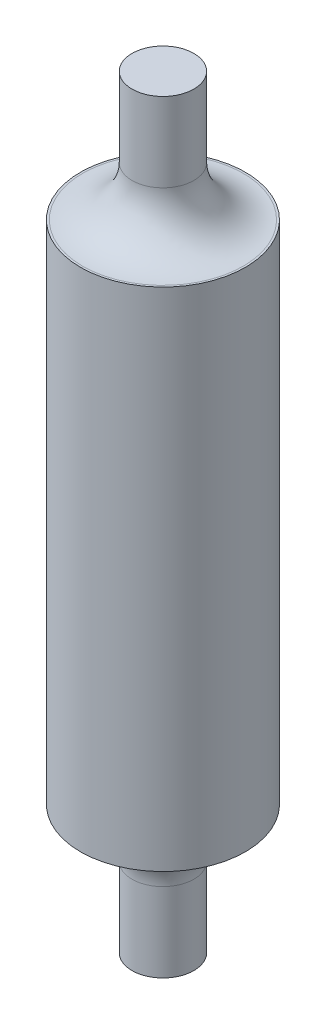
ISO-10303-21;
HEADER;
FILE_DESCRIPTION(('STEP AP214'),'2;1');
FILE_NAME('part.step','',(''),(''),'','','');
FILE_SCHEMA(('AUTOMOTIVE_DESIGN { 1 0 10303 214 1 1 1 1 }'));
ENDSEC;
DATA;
#1=APPLICATION_CONTEXT('core data for automotive mechanical design processes');
#2=APPLICATION_PROTOCOL_DEFINITION('international standard','automotive_design',2000,#1);
#3=PRODUCT_CONTEXT('',#1,'mechanical');
#4=PRODUCT('Part','Part','',(#3));
#5=PRODUCT_RELATED_PRODUCT_CATEGORY('part','',(#4));
#6=PRODUCT_DEFINITION_FORMATION('','',#4);
#7=PRODUCT_DEFINITION_CONTEXT('part definition',#1,'design');
#8=PRODUCT_DEFINITION('design','',#6,#7);
#9=PRODUCT_DEFINITION_SHAPE('','',#8);
#10=(LENGTH_UNIT() NAMED_UNIT(*) SI_UNIT(.MILLI.,.METRE.));
#11=(NAMED_UNIT(*) PLANE_ANGLE_UNIT() SI_UNIT($,.RADIAN.));
#12=(NAMED_UNIT(*) SI_UNIT($,.STERADIAN.) SOLID_ANGLE_UNIT());
#13=UNCERTAINTY_MEASURE_WITH_UNIT(LENGTH_MEASURE(1.E-05),#10,'distance_accuracy_value','');
#14=(GEOMETRIC_REPRESENTATION_CONTEXT(3) GLOBAL_UNCERTAINTY_ASSIGNED_CONTEXT((#13)) GLOBAL_UNIT_ASSIGNED_CONTEXT((#10,
#11,#12)) REPRESENTATION_CONTEXT('',''));
#15=CARTESIAN_POINT('',(0.,0.,0.));
#16=DIRECTION('',(0.,0.,1.));
#17=DIRECTION('',(1.,0.,0.));
#18=AXIS2_PLACEMENT_3D('',#15,#16,#17);
#19=CARTESIAN_POINT('',(0.,77.978,0.));
#20=DIRECTION('',(0.,-1.,0.));
#21=DIRECTION('',(0.,0.,-1.));
#22=AXIS2_PLACEMENT_3D('',#19,#20,#21);
#23=CYLINDRICAL_SURFACE('',#22,12.7);
#24=CARTESIAN_POINT('',(0.,77.978,0.));
#25=DIRECTION('',(0.,1.,0.));
#26=DIRECTION('',(0.,0.,1.));
#27=AXIS2_PLACEMENT_3D('',#24,#25,#26);
#28=CIRCLE('',#27,12.7);
#29=CARTESIAN_POINT('',(0.,77.978,12.7));
#30=VERTEX_POINT('',#29);
#31=EDGE_CURVE('E60',#30,#30,#28,.T.);
#32=ORIENTED_EDGE('',*,*,#31,.F.);
#33=EDGE_LOOP('',(#32));
#34=FACE_BOUND('',#33,.T.);
#35=CARTESIAN_POINT('',(0.,0.,0.));
#36=DIRECTION('',(0.,1.,0.));
#37=DIRECTION('',(0.,0.,1.));
#38=AXIS2_PLACEMENT_3D('',#35,#36,#37);
#39=CIRCLE('',#38,12.7);
#40=CARTESIAN_POINT('',(0.,0.,12.7));
#41=VERTEX_POINT('',#40);
#42=EDGE_CURVE('E61',#41,#41,#39,.T.);
#43=ORIENTED_EDGE('',*,*,#42,.T.);
#44=EDGE_LOOP('',(#43));
#45=FACE_BOUND('',#44,.T.);
#46=ADVANCED_FACE('F40',(#34,#45),#23,.T.);
#47=CARTESIAN_POINT('',(0.,77.978,0.));
#48=DIRECTION('',(0.,1.,0.));
#49=DIRECTION('',(0.,0.,1.));
#50=AXIS2_PLACEMENT_3D('',#47,#48,#49);
#51=PLANE('',#50);
#52=CARTESIAN_POINT('',(0.,77.978,0.));
#53=DIRECTION('',(0.,1.,0.));
#54=DIRECTION('',(0.,0.,1.));
#55=AXIS2_PLACEMENT_3D('',#52,#53,#54);
#56=CIRCLE('',#55,12.3825);
#57=CARTESIAN_POINT('',(0.,77.978,12.3825));
#58=VERTEX_POINT('',#57);
#59=EDGE_CURVE('E10',#58,#58,#56,.F.);
#60=ORIENTED_EDGE('',*,*,#59,.T.);
#61=EDGE_LOOP('',(#60));
#62=FACE_BOUND('',#61,.T.);
#63=ORIENTED_EDGE('',*,*,#31,.T.);
#64=EDGE_LOOP('',(#63));
#65=FACE_BOUND('',#64,.T.);
#66=ADVANCED_FACE('F90',(#62,#65),#51,.T.);
#67=CARTESIAN_POINT('',(0.,0.,0.));
#68=DIRECTION('',(0.,1.,0.));
#69=DIRECTION('',(0.,0.,1.));
#70=AXIS2_PLACEMENT_3D('',#67,#68,#69);
#71=PLANE('',#70);
#72=CARTESIAN_POINT('',(0.,0.,0.));
#73=DIRECTION('',(0.,1.,0.));
#74=DIRECTION('',(0.,0.,1.));
#75=AXIS2_PLACEMENT_3D('',#72,#73,#74);
#76=CIRCLE('',#75,12.3825);
#77=CARTESIAN_POINT('',(0.,0.,12.3825));
#78=VERTEX_POINT('',#77);
#79=EDGE_CURVE('E55',#78,#78,#76,.T.);
#80=ORIENTED_EDGE('',*,*,#79,.T.);
#81=EDGE_LOOP('',(#80));
#82=FACE_BOUND('',#81,.T.);
#83=ORIENTED_EDGE('',*,*,#42,.F.);
#84=EDGE_LOOP('',(#83));
#85=FACE_BOUND('',#84,.T.);
#86=ADVANCED_FACE('F95',(#82,#85),#71,.F.);
#87=CARTESIAN_POINT('',(0.,97.79,0.));
#88=DIRECTION('',(0.,-1.,0.));
#89=DIRECTION('',(0.,0.,-1.));
#90=AXIS2_PLACEMENT_3D('',#87,#88,#89);
#91=CYLINDRICAL_SURFACE('',#90,4.7625);
#92=CARTESIAN_POINT('',(0.,85.598,0.));
#93=DIRECTION('',(0.,1.,0.));
#94=DIRECTION('',(0.,0.,1.));
#95=AXIS2_PLACEMENT_3D('',#92,#93,#94);
#96=CIRCLE('',#95,4.7625);
#97=CARTESIAN_POINT('',(0.,85.598,4.7625));
#98=VERTEX_POINT('',#97);
#99=EDGE_CURVE('E47',#98,#98,#96,.T.);
#100=ORIENTED_EDGE('',*,*,#99,.T.);
#101=EDGE_LOOP('',(#100));
#102=FACE_BOUND('',#101,.T.);
#103=CARTESIAN_POINT('',(0.,97.79,0.));
#104=DIRECTION('',(0.,1.,0.));
#105=DIRECTION('',(0.,0.,1.));
#106=AXIS2_PLACEMENT_3D('',#103,#104,#105);
#107=CIRCLE('',#106,4.7625);
#108=CARTESIAN_POINT('',(0.,97.79,4.7625));
#109=VERTEX_POINT('',#108);
#110=EDGE_CURVE('E64',#109,#109,#107,.T.);
#111=ORIENTED_EDGE('',*,*,#110,.F.);
#112=EDGE_LOOP('',(#111));
#113=FACE_BOUND('',#112,.T.);
#114=ADVANCED_FACE('F101',(#102,#113),#91,.T.);
#115=CARTESIAN_POINT('',(0.,97.79,0.));
#116=DIRECTION('',(0.,1.,0.));
#117=DIRECTION('',(0.,0.,1.));
#118=AXIS2_PLACEMENT_3D('',#115,#116,#117);
#119=PLANE('',#118);
#120=ORIENTED_EDGE('',*,*,#110,.T.);
#121=EDGE_LOOP('',(#120));
#122=FACE_BOUND('',#121,.T.);
#123=ADVANCED_FACE('F86',(#122),#119,.T.);
#124=CARTESIAN_POINT('',(0.,-19.812,0.));
#125=DIRECTION('',(0.,1.,0.));
#126=DIRECTION('',(0.,0.,1.));
#127=AXIS2_PLACEMENT_3D('',#124,#125,#126);
#128=CYLINDRICAL_SURFACE('',#127,4.7625);
#129=CARTESIAN_POINT('',(0.,-7.62,0.));
#130=DIRECTION('',(0.,1.,0.));
#131=DIRECTION('',(0.,0.,1.));
#132=AXIS2_PLACEMENT_3D('',#129,#130,#131);
#133=CIRCLE('',#132,4.7625);
#134=CARTESIAN_POINT('',(0.,-7.62,4.7625));
#135=VERTEX_POINT('',#134);
#136=EDGE_CURVE('E51',#135,#135,#133,.F.);
#137=ORIENTED_EDGE('',*,*,#136,.T.);
#138=EDGE_LOOP('',(#137));
#139=FACE_BOUND('',#138,.T.);
#140=CARTESIAN_POINT('',(0.,-19.812,0.));
#141=DIRECTION('',(0.,1.,0.));
#142=DIRECTION('',(0.,0.,1.));
#143=AXIS2_PLACEMENT_3D('',#140,#141,#142);
#144=CIRCLE('',#143,4.7625);
#145=CARTESIAN_POINT('',(0.,-19.812,4.7625));
#146=VERTEX_POINT('',#145);
#147=EDGE_CURVE('E69',#146,#146,#144,.T.);
#148=ORIENTED_EDGE('',*,*,#147,.T.);
#149=EDGE_LOOP('',(#148));
#150=FACE_BOUND('',#149,.T.);
#151=ADVANCED_FACE('F73',(#139,#150),#128,.T.);
#152=CARTESIAN_POINT('',(0.,-19.812,0.));
#153=DIRECTION('',(0.,-1.,0.));
#154=DIRECTION('',(0.,0.,1.));
#155=AXIS2_PLACEMENT_3D('',#152,#153,#154);
#156=PLANE('',#155);
#157=ORIENTED_EDGE('',*,*,#147,.F.);
#158=EDGE_LOOP('',(#157));
#159=FACE_BOUND('',#158,.T.);
#160=ADVANCED_FACE('F75',(#159),#156,.T.);
#161=CARTESIAN_POINT('',(0.,-7.62,0.));
#162=DIRECTION('',(0.,1.,0.));
#163=DIRECTION('',(0.,0.,1.));
#164=AXIS2_PLACEMENT_3D('',#161,#162,#163);
#165=TOROIDAL_SURFACE('',#164,12.3825,7.62);
#166=ORIENTED_EDGE('',*,*,#136,.F.);
#167=EDGE_LOOP('',(#166));
#168=FACE_BOUND('',#167,.T.);
#169=ORIENTED_EDGE('',*,*,#79,.F.);
#170=EDGE_LOOP('',(#169));
#171=FACE_BOUND('',#170,.T.);
#172=ADVANCED_FACE('F77',(#168,#171),#165,.F.);
#173=CARTESIAN_POINT('',(0.,85.598,0.));
#174=DIRECTION('',(0.,1.,0.));
#175=DIRECTION('',(0.,0.,1.));
#176=AXIS2_PLACEMENT_3D('',#173,#174,#175);
#177=TOROIDAL_SURFACE('',#176,12.3825,7.62);
#178=ORIENTED_EDGE('',*,*,#59,.F.);
#179=EDGE_LOOP('',(#178));
#180=FACE_BOUND('',#179,.T.);
#181=ORIENTED_EDGE('',*,*,#99,.F.);
#182=EDGE_LOOP('',(#181));
#183=FACE_BOUND('',#182,.T.);
#184=ADVANCED_FACE('F42',(#180,#183),#177,.F.);
#185=CLOSED_SHELL('',(#46,#66,#86,#114,#123,#151,#160,#172,#184));
#186=MANIFOLD_SOLID_BREP('B2',#185);
#187=ADVANCED_BREP_SHAPE_REPRESENTATION('',(#18,#186),#14);
#188=SHAPE_DEFINITION_REPRESENTATION(#9,#187);
ENDSEC;
END-ISO-10303-21;
